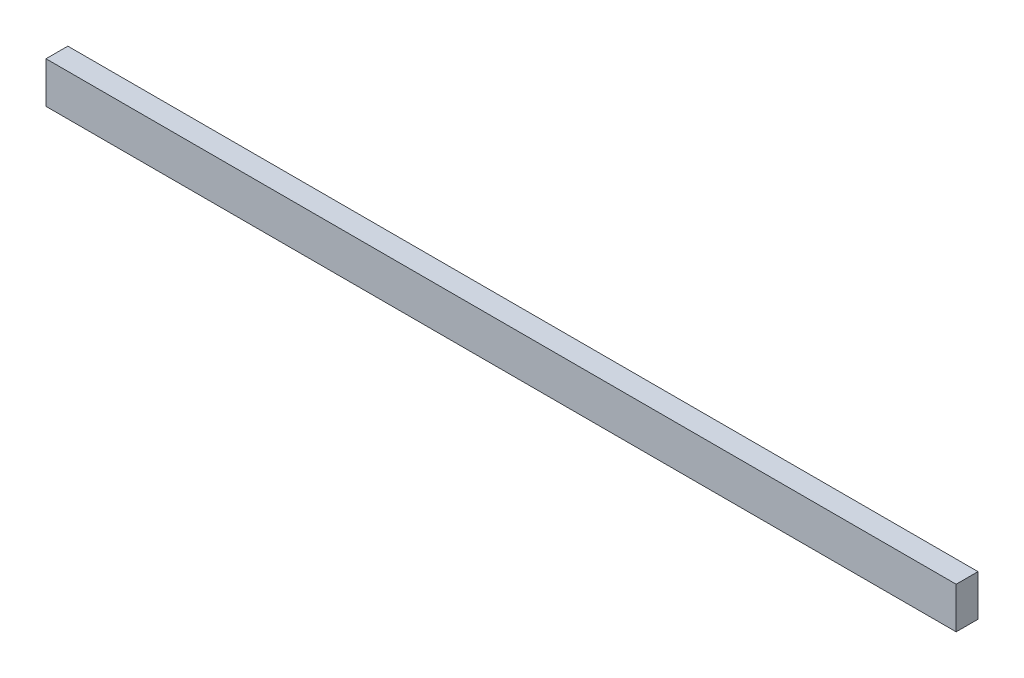
ISO-10303-21;
HEADER;
FILE_DESCRIPTION(('STEP AP214'),'2;1');
FILE_NAME('part.step','',(''),(''),'','','');
FILE_SCHEMA(('AUTOMOTIVE_DESIGN { 1 0 10303 214 1 1 1 1 }'));
ENDSEC;
DATA;
#1=APPLICATION_CONTEXT('core data for automotive mechanical design processes');
#2=APPLICATION_PROTOCOL_DEFINITION('international standard','automotive_design',2000,#1);
#3=PRODUCT_CONTEXT('',#1,'mechanical');
#4=PRODUCT('Part','Part','',(#3));
#5=PRODUCT_RELATED_PRODUCT_CATEGORY('part','',(#4));
#6=PRODUCT_DEFINITION_FORMATION('','',#4);
#7=PRODUCT_DEFINITION_CONTEXT('part definition',#1,'design');
#8=PRODUCT_DEFINITION('design','',#6,#7);
#9=PRODUCT_DEFINITION_SHAPE('','',#8);
#10=(LENGTH_UNIT() NAMED_UNIT(*) SI_UNIT(.MILLI.,.METRE.));
#11=(NAMED_UNIT(*) PLANE_ANGLE_UNIT() SI_UNIT($,.RADIAN.));
#12=(NAMED_UNIT(*) SI_UNIT($,.STERADIAN.) SOLID_ANGLE_UNIT());
#13=UNCERTAINTY_MEASURE_WITH_UNIT(LENGTH_MEASURE(1.E-05),#10,'distance_accuracy_value','');
#14=(GEOMETRIC_REPRESENTATION_CONTEXT(3) GLOBAL_UNCERTAINTY_ASSIGNED_CONTEXT((#13)) GLOBAL_UNIT_ASSIGNED_CONTEXT((#10,
#11,#12)) REPRESENTATION_CONTEXT('',''));
#15=CARTESIAN_POINT('',(0.,0.,0.));
#16=DIRECTION('',(0.,0.,1.));
#17=DIRECTION('',(1.,0.,0.));
#18=AXIS2_PLACEMENT_3D('',#15,#16,#17);
#19=CARTESIAN_POINT('',(375.,-17.,18.));
#20=DIRECTION('',(-1.,0.,0.));
#21=DIRECTION('',(0.,0.,1.));
#22=AXIS2_PLACEMENT_3D('',#19,#20,#21);
#23=PLANE('',#22);
#24=DIRECTION('',(0.,1.,0.));
#25=VECTOR('',#24,1.);
#26=CARTESIAN_POINT('',(375.,-17.,0.));
#27=LINE('',#26,#25);
#28=CARTESIAN_POINT('',(375.,-17.,0.));
#29=VERTEX_POINT('',#28);
#30=CARTESIAN_POINT('',(375.,17.,0.));
#31=VERTEX_POINT('',#30);
#32=EDGE_CURVE('E96',#29,#31,#27,.T.);
#33=ORIENTED_EDGE('',*,*,#32,.T.);
#34=DIRECTION('',(0.,0.,-1.));
#35=VECTOR('',#34,1.);
#36=CARTESIAN_POINT('',(375.,17.,18.));
#37=LINE('',#36,#35);
#38=CARTESIAN_POINT('',(375.,17.,18.));
#39=VERTEX_POINT('',#38);
#40=EDGE_CURVE('E11',#39,#31,#37,.T.);
#41=ORIENTED_EDGE('',*,*,#40,.F.);
#42=DIRECTION('',(0.,1.,0.));
#43=VECTOR('',#42,1.);
#44=CARTESIAN_POINT('',(375.,-17.,18.));
#45=LINE('',#44,#43);
#46=CARTESIAN_POINT('',(375.,-17.,18.));
#47=VERTEX_POINT('',#46);
#48=EDGE_CURVE('E84',#47,#39,#45,.T.);
#49=ORIENTED_EDGE('',*,*,#48,.F.);
#50=DIRECTION('',(0.,0.,-1.));
#51=VECTOR('',#50,1.);
#52=CARTESIAN_POINT('',(375.,-17.,18.));
#53=LINE('',#52,#51);
#54=EDGE_CURVE('E92',#47,#29,#53,.T.);
#55=ORIENTED_EDGE('',*,*,#54,.T.);
#56=EDGE_LOOP('',(#33,#41,#49,#55));
#57=FACE_BOUND('',#56,.T.);
#58=ADVANCED_FACE('F33',(#57),#23,.F.);
#59=CARTESIAN_POINT('',(-375.,17.,18.));
#60=DIRECTION('',(0.,-1.,0.));
#61=DIRECTION('',(0.,0.,-1.));
#62=AXIS2_PLACEMENT_3D('',#59,#60,#61);
#63=PLANE('',#62);
#64=DIRECTION('',(-1.,0.,0.));
#65=VECTOR('',#64,1.);
#66=CARTESIAN_POINT('',(-375.,17.,0.));
#67=LINE('',#66,#65);
#68=CARTESIAN_POINT('',(-375.,17.,0.));
#69=VERTEX_POINT('',#68);
#70=EDGE_CURVE('E88',#31,#69,#67,.T.);
#71=ORIENTED_EDGE('',*,*,#70,.T.);
#72=DIRECTION('',(0.,0.,-1.));
#73=VECTOR('',#72,1.);
#74=CARTESIAN_POINT('',(-375.,17.,18.));
#75=LINE('',#74,#73);
#76=CARTESIAN_POINT('',(-375.,17.,18.));
#77=VERTEX_POINT('',#76);
#78=EDGE_CURVE('E41',#77,#69,#75,.T.);
#79=ORIENTED_EDGE('',*,*,#78,.F.);
#80=DIRECTION('',(-1.,0.,0.));
#81=VECTOR('',#80,1.);
#82=CARTESIAN_POINT('',(-375.,17.,18.));
#83=LINE('',#82,#81);
#84=EDGE_CURVE('E79',#39,#77,#83,.T.);
#85=ORIENTED_EDGE('',*,*,#84,.F.);
#86=ORIENTED_EDGE('',*,*,#40,.T.);
#87=EDGE_LOOP('',(#71,#79,#85,#86));
#88=FACE_BOUND('',#87,.T.);
#89=ADVANCED_FACE('F87',(#88),#63,.F.);
#90=CARTESIAN_POINT('',(-375.,-17.,18.));
#91=DIRECTION('',(1.,0.,0.));
#92=DIRECTION('',(0.,0.,-1.));
#93=AXIS2_PLACEMENT_3D('',#90,#91,#92);
#94=PLANE('',#93);
#95=DIRECTION('',(0.,-1.,0.));
#96=VECTOR('',#95,1.);
#97=CARTESIAN_POINT('',(-375.,-17.,0.));
#98=LINE('',#97,#96);
#99=CARTESIAN_POINT('',(-375.,-17.,0.));
#100=VERTEX_POINT('',#99);
#101=EDGE_CURVE('E66',#69,#100,#98,.T.);
#102=ORIENTED_EDGE('',*,*,#101,.T.);
#103=DIRECTION('',(0.,0.,-1.));
#104=VECTOR('',#103,1.);
#105=CARTESIAN_POINT('',(-375.,-17.,18.));
#106=LINE('',#105,#104);
#107=CARTESIAN_POINT('',(-375.,-17.,18.));
#108=VERTEX_POINT('',#107);
#109=EDGE_CURVE('E89',#108,#100,#106,.T.);
#110=ORIENTED_EDGE('',*,*,#109,.F.);
#111=DIRECTION('',(0.,-1.,0.));
#112=VECTOR('',#111,1.);
#113=CARTESIAN_POINT('',(-375.,-17.,18.));
#114=LINE('',#113,#112);
#115=EDGE_CURVE('E82',#77,#108,#114,.T.);
#116=ORIENTED_EDGE('',*,*,#115,.F.);
#117=ORIENTED_EDGE('',*,*,#78,.T.);
#118=EDGE_LOOP('',(#102,#110,#116,#117));
#119=FACE_BOUND('',#118,.T.);
#120=ADVANCED_FACE('F90',(#119),#94,.F.);
#121=CARTESIAN_POINT('',(-375.,-17.,18.));
#122=DIRECTION('',(0.,1.,0.));
#123=DIRECTION('',(0.,0.,1.));
#124=AXIS2_PLACEMENT_3D('',#121,#122,#123);
#125=PLANE('',#124);
#126=DIRECTION('',(1.,0.,0.));
#127=VECTOR('',#126,1.);
#128=CARTESIAN_POINT('',(-375.,-17.,0.));
#129=LINE('',#128,#127);
#130=EDGE_CURVE('E72',#100,#29,#129,.T.);
#131=ORIENTED_EDGE('',*,*,#130,.T.);
#132=ORIENTED_EDGE('',*,*,#54,.F.);
#133=DIRECTION('',(1.,0.,0.));
#134=VECTOR('',#133,1.);
#135=CARTESIAN_POINT('',(-375.,-17.,18.));
#136=LINE('',#135,#134);
#137=EDGE_CURVE('E49',#108,#47,#136,.T.);
#138=ORIENTED_EDGE('',*,*,#137,.F.);
#139=ORIENTED_EDGE('',*,*,#109,.T.);
#140=EDGE_LOOP('',(#131,#132,#138,#139));
#141=FACE_BOUND('',#140,.T.);
#142=ADVANCED_FACE('F103',(#141),#125,.F.);
#143=CARTESIAN_POINT('',(0.,0.,18.));
#144=DIRECTION('',(0.,0.,-1.));
#145=DIRECTION('',(-1.,0.,0.));
#146=AXIS2_PLACEMENT_3D('',#143,#144,#145);
#147=PLANE('',#146);
#148=ORIENTED_EDGE('',*,*,#48,.T.);
#149=ORIENTED_EDGE('',*,*,#84,.T.);
#150=ORIENTED_EDGE('',*,*,#115,.T.);
#151=ORIENTED_EDGE('',*,*,#137,.T.);
#152=EDGE_LOOP('',(#148,#149,#150,#151));
#153=FACE_BOUND('',#152,.T.);
#154=ADVANCED_FACE('F80',(#153),#147,.F.);
#155=CARTESIAN_POINT('',(0.,0.,0.));
#156=DIRECTION('',(0.,0.,-1.));
#157=DIRECTION('',(-1.,0.,0.));
#158=AXIS2_PLACEMENT_3D('',#155,#156,#157);
#159=PLANE('',#158);
#160=ORIENTED_EDGE('',*,*,#32,.F.);
#161=ORIENTED_EDGE('',*,*,#130,.F.);
#162=ORIENTED_EDGE('',*,*,#101,.F.);
#163=ORIENTED_EDGE('',*,*,#70,.F.);
#164=EDGE_LOOP('',(#160,#161,#162,#163));
#165=FACE_BOUND('',#164,.T.);
#166=ADVANCED_FACE('F106',(#165),#159,.T.);
#167=CLOSED_SHELL('',(#58,#89,#120,#142,#154,#166));
#168=MANIFOLD_SOLID_BREP('B2',#167);
#169=ADVANCED_BREP_SHAPE_REPRESENTATION('',(#18,#168),#14);
#170=SHAPE_DEFINITION_REPRESENTATION(#9,#169);
ENDSEC;
END-ISO-10303-21;
